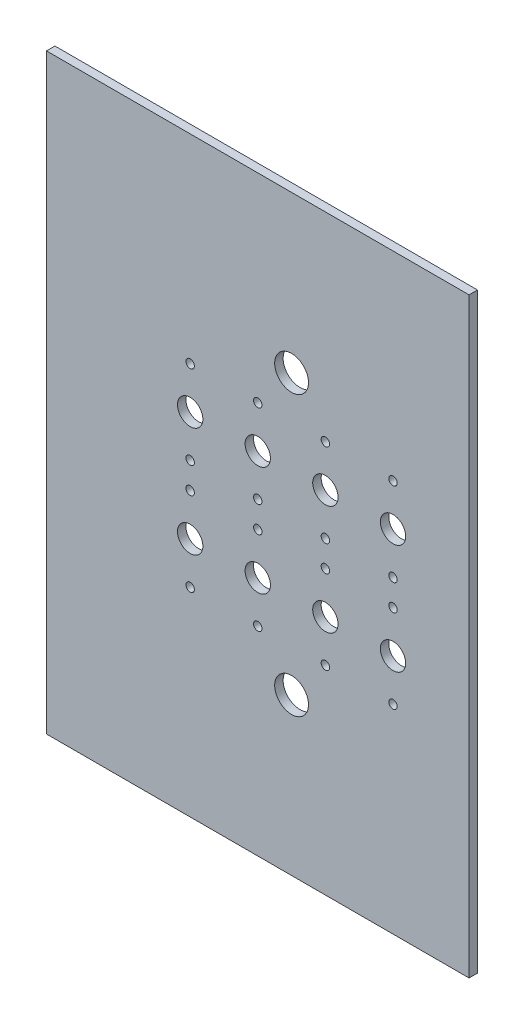
ISO-10303-21;
HEADER;
FILE_DESCRIPTION(('STEP AP214'),'2;1');
FILE_NAME('part.step','',(''),(''),'','','');
FILE_SCHEMA(('AUTOMOTIVE_DESIGN { 1 0 10303 214 1 1 1 1 }'));
ENDSEC;
DATA;
#1=APPLICATION_CONTEXT('core data for automotive mechanical design processes');
#2=APPLICATION_PROTOCOL_DEFINITION('international standard','automotive_design',2000,#1);
#3=PRODUCT_CONTEXT('',#1,'mechanical');
#4=PRODUCT('Part','Part','',(#3));
#5=PRODUCT_RELATED_PRODUCT_CATEGORY('part','',(#4));
#6=PRODUCT_DEFINITION_FORMATION('','',#4);
#7=PRODUCT_DEFINITION_CONTEXT('part definition',#1,'design');
#8=PRODUCT_DEFINITION('design','',#6,#7);
#9=PRODUCT_DEFINITION_SHAPE('','',#8);
#10=(LENGTH_UNIT() NAMED_UNIT(*) SI_UNIT(.MILLI.,.METRE.));
#11=(NAMED_UNIT(*) PLANE_ANGLE_UNIT() SI_UNIT($,.RADIAN.));
#12=(NAMED_UNIT(*) SI_UNIT($,.STERADIAN.) SOLID_ANGLE_UNIT());
#13=UNCERTAINTY_MEASURE_WITH_UNIT(LENGTH_MEASURE(1.E-05),#10,'distance_accuracy_value','');
#14=(GEOMETRIC_REPRESENTATION_CONTEXT(3) GLOBAL_UNCERTAINTY_ASSIGNED_CONTEXT((#13)) GLOBAL_UNIT_ASSIGNED_CONTEXT((#10,
#11,#12)) REPRESENTATION_CONTEXT('',''));
#15=CARTESIAN_POINT('',(0.,0.,0.));
#16=DIRECTION('',(0.,0.,1.));
#17=DIRECTION('',(1.,0.,0.));
#18=AXIS2_PLACEMENT_3D('',#15,#16,#17);
#19=CARTESIAN_POINT('',(0.,0.,10.));
#20=DIRECTION('',(0.,0.,-1.00000000000002));
#21=DIRECTION('',(-1.,0.,0.));
#22=AXIS2_PLACEMENT_3D('',#19,#20,#21);
#23=PLANE('',#22);
#24=CARTESIAN_POINT('',(330.,-65.000000000001,9.99999999999795));
#25=DIRECTION('',(0.,0.,1.00000000000002));
#26=DIRECTION('',(1.,0.,0.));
#27=AXIS2_PLACEMENT_3D('',#24,#25,#26);
#28=CIRCLE('',#27,14.9999999999997);
#29=CARTESIAN_POINT('',(345.,-65.000000000001,9.9999999999979));
#30=VERTEX_POINT('',#29);
#31=EDGE_CURVE('E240',#30,#30,#28,.T.);
#32=ORIENTED_EDGE('',*,*,#31,.F.);
#33=EDGE_LOOP('',(#32));
#34=FACE_BOUND('',#33,.T.);
#35=CARTESIAN_POINT('',(170.,-65.000000000001,9.99999999999795));
#36=DIRECTION('',(0.,0.,1.00000000000002));
#37=DIRECTION('',(1.,0.,0.));
#38=AXIS2_PLACEMENT_3D('',#35,#36,#37);
#39=CIRCLE('',#38,15.);
#40=CARTESIAN_POINT('',(185.,-65.000000000001,9.9999999999979));
#41=VERTEX_POINT('',#40);
#42=EDGE_CURVE('E221',#41,#41,#39,.T.);
#43=ORIENTED_EDGE('',*,*,#42,.F.);
#44=EDGE_LOOP('',(#43));
#45=FACE_BOUND('',#44,.T.);
#46=CARTESIAN_POINT('',(410.,-114.500000000002,9.99999999999795));
#47=DIRECTION('',(0.,0.,1.00000000000002));
#48=DIRECTION('',(1.,0.,0.));
#49=AXIS2_PLACEMENT_3D('',#46,#47,#48);
#50=CIRCLE('',#49,4.99999999999901);
#51=CARTESIAN_POINT('',(414.999999999999,-114.500000000002,9.99999999999793));
#52=VERTEX_POINT('',#51);
#53=EDGE_CURVE('E215',#52,#52,#50,.T.);
#54=ORIENTED_EDGE('',*,*,#53,.F.);
#55=EDGE_LOOP('',(#54));
#56=FACE_BOUND('',#55,.T.);
#57=CARTESIAN_POINT('',(330.,-114.500000000002,9.99999999999795));
#58=DIRECTION('',(0.,0.,1.00000000000002));
#59=DIRECTION('',(1.,0.,0.));
#60=AXIS2_PLACEMENT_3D('',#57,#58,#59);
#61=CIRCLE('',#60,4.99999999999901);
#62=CARTESIAN_POINT('',(334.999999999999,-114.500000000002,9.99999999999793));
#63=VERTEX_POINT('',#62);
#64=EDGE_CURVE('E199',#63,#63,#61,.T.);
#65=ORIENTED_EDGE('',*,*,#64,.F.);
#66=EDGE_LOOP('',(#65));
#67=FACE_BOUND('',#66,.T.);
#68=CARTESIAN_POINT('',(250.,-114.500000000002,9.99999999999795));
#69=DIRECTION('',(0.,0.,1.00000000000002));
#70=DIRECTION('',(1.,0.,0.));
#71=AXIS2_PLACEMENT_3D('',#68,#69,#70);
#72=CIRCLE('',#71,4.99999999999989);
#73=CARTESIAN_POINT('',(255.,-114.500000000002,9.99999999999793));
#74=VERTEX_POINT('',#73);
#75=EDGE_CURVE('E187',#74,#74,#72,.T.);
#76=ORIENTED_EDGE('',*,*,#75,.F.);
#77=EDGE_LOOP('',(#76));
#78=FACE_BOUND('',#77,.T.);
#79=CARTESIAN_POINT('',(170.,-114.500000000002,9.99999999999795));
#80=DIRECTION('',(0.,0.,1.00000000000002));
#81=DIRECTION('',(1.,0.,0.));
#82=AXIS2_PLACEMENT_3D('',#79,#80,#81);
#83=CIRCLE('',#82,4.99999999999989);
#84=CARTESIAN_POINT('',(175.,-114.500000000002,9.99999999999793));
#85=VERTEX_POINT('',#84);
#86=EDGE_CURVE('E176',#85,#85,#83,.T.);
#87=ORIENTED_EDGE('',*,*,#86,.F.);
#88=EDGE_LOOP('',(#87));
#89=FACE_BOUND('',#88,.T.);
#90=CARTESIAN_POINT('',(330.,65.0000000000014,9.99999999999795));
#91=DIRECTION('',(0.,0.,1.00000000000002));
#92=DIRECTION('',(1.,0.,0.));
#93=AXIS2_PLACEMENT_3D('',#90,#91,#92);
#94=CIRCLE('',#93,14.9999999999997);
#95=CARTESIAN_POINT('',(345.,65.0000000000014,9.9999999999979));
#96=VERTEX_POINT('',#95);
#97=EDGE_CURVE('E163',#96,#96,#94,.T.);
#98=ORIENTED_EDGE('',*,*,#97,.F.);
#99=EDGE_LOOP('',(#98));
#100=FACE_BOUND('',#99,.T.);
#101=CARTESIAN_POINT('',(170.,65.0000000000014,9.99999999999795));
#102=DIRECTION('',(0.,0.,1.00000000000002));
#103=DIRECTION('',(1.,0.,0.));
#104=AXIS2_PLACEMENT_3D('',#101,#102,#103);
#105=CIRCLE('',#104,15.);
#106=CARTESIAN_POINT('',(185.,65.0000000000014,9.9999999999979));
#107=VERTEX_POINT('',#106);
#108=EDGE_CURVE('E155',#107,#107,#105,.T.);
#109=ORIENTED_EDGE('',*,*,#108,.F.);
#110=EDGE_LOOP('',(#109));
#111=FACE_BOUND('',#110,.T.);
#112=CARTESIAN_POINT('',(290.,165.,9.99999999999795));
#113=DIRECTION('',(0.,0.,1.00000000000002));
#114=DIRECTION('',(1.,0.,0.));
#115=AXIS2_PLACEMENT_3D('',#112,#113,#114);
#116=CIRCLE('',#115,20.);
#117=CARTESIAN_POINT('',(310.,165.,9.99999999999789));
#118=VERTEX_POINT('',#117);
#119=EDGE_CURVE('E139',#118,#118,#116,.T.);
#120=ORIENTED_EDGE('',*,*,#119,.F.);
#121=EDGE_LOOP('',(#120));
#122=FACE_BOUND('',#121,.T.);
#123=CARTESIAN_POINT('',(410.,114.500000000003,9.99999999999795));
#124=DIRECTION('',(0.,0.,1.00000000000002));
#125=DIRECTION('',(1.,0.,0.));
#126=AXIS2_PLACEMENT_3D('',#123,#124,#125);
#127=CIRCLE('',#126,4.99999999999901);
#128=CARTESIAN_POINT('',(414.999999999999,114.500000000003,9.99999999999793));
#129=VERTEX_POINT('',#128);
#130=EDGE_CURVE('E128',#129,#129,#127,.T.);
#131=ORIENTED_EDGE('',*,*,#130,.F.);
#132=EDGE_LOOP('',(#131));
#133=FACE_BOUND('',#132,.T.);
#134=CARTESIAN_POINT('',(330.,114.500000000003,9.99999999999795));
#135=DIRECTION('',(0.,0.,1.00000000000002));
#136=DIRECTION('',(1.,0.,0.));
#137=AXIS2_PLACEMENT_3D('',#134,#135,#136);
#138=CIRCLE('',#137,4.99999999999901);
#139=CARTESIAN_POINT('',(334.999999999999,114.500000000003,9.99999999999793));
#140=VERTEX_POINT('',#139);
#141=EDGE_CURVE('E116',#140,#140,#138,.T.);
#142=ORIENTED_EDGE('',*,*,#141,.F.);
#143=EDGE_LOOP('',(#142));
#144=FACE_BOUND('',#143,.T.);
#145=CARTESIAN_POINT('',(250.,114.500000000003,9.99999999999795));
#146=DIRECTION('',(0.,0.,1.00000000000002));
#147=DIRECTION('',(1.,0.,0.));
#148=AXIS2_PLACEMENT_3D('',#145,#146,#147);
#149=CIRCLE('',#148,4.99999999999989);
#150=CARTESIAN_POINT('',(255.,114.500000000003,9.99999999999793));
#151=VERTEX_POINT('',#150);
#152=EDGE_CURVE('E102',#151,#151,#149,.T.);
#153=ORIENTED_EDGE('',*,*,#152,.F.);
#154=EDGE_LOOP('',(#153));
#155=FACE_BOUND('',#154,.T.);
#156=CARTESIAN_POINT('',(170.,114.500000000003,9.99999999999795));
#157=DIRECTION('',(0.,0.,1.00000000000002));
#158=DIRECTION('',(1.,0.,0.));
#159=AXIS2_PLACEMENT_3D('',#156,#157,#158);
#160=CIRCLE('',#159,4.99999999999989);
#161=CARTESIAN_POINT('',(175.,114.500000000003,9.99999999999793));
#162=VERTEX_POINT('',#161);
#163=EDGE_CURVE('E83',#162,#162,#160,.T.);
#164=ORIENTED_EDGE('',*,*,#163,.F.);
#165=EDGE_LOOP('',(#164));
#166=FACE_BOUND('',#165,.T.);
#167=DIRECTION('',(0.,-1.00000000000002,0.));
#168=VECTOR('',#167,1.);
#169=CARTESIAN_POINT('',(0.,-350.,10.));
#170=LINE('',#169,#168);
#171=CARTESIAN_POINT('',(0.,350.000000000004,10.));
#172=VERTEX_POINT('',#171);
#173=CARTESIAN_POINT('',(0.,-350.,10.));
#174=VERTEX_POINT('',#173);
#175=EDGE_CURVE('E68',#172,#174,#170,.T.);
#176=ORIENTED_EDGE('',*,*,#175,.T.);
#177=DIRECTION('',(1.,0.,0.));
#178=VECTOR('',#177,1.);
#179=CARTESIAN_POINT('',(500.,-350.,9.9999999999979));
#180=LINE('',#179,#178);
#181=CARTESIAN_POINT('',(500.,-350.,9.9999999999979));
#182=VERTEX_POINT('',#181);
#183=EDGE_CURVE('E64',#174,#182,#180,.T.);
#184=ORIENTED_EDGE('',*,*,#183,.T.);
#185=DIRECTION('',(0.,1.00000000000002,0.));
#186=VECTOR('',#185,1.);
#187=CARTESIAN_POINT('',(500.,350.000000000004,9.9999999999979));
#188=LINE('',#187,#186);
#189=CARTESIAN_POINT('',(500.,350.000000000004,9.9999999999979));
#190=VERTEX_POINT('',#189);
#191=EDGE_CURVE('E66',#182,#190,#188,.T.);
#192=ORIENTED_EDGE('',*,*,#191,.T.);
#193=DIRECTION('',(-1.,0.,0.));
#194=VECTOR('',#193,1.);
#195=CARTESIAN_POINT('',(0.,350.000000000004,10.));
#196=LINE('',#195,#194);
#197=EDGE_CURVE('E31',#190,#172,#196,.T.);
#198=ORIENTED_EDGE('',*,*,#197,.T.);
#199=EDGE_LOOP('',(#176,#184,#192,#198));
#200=FACE_BOUND('',#199,.T.);
#201=CARTESIAN_POINT('',(170.,15.5,9.99999999999795));
#202=DIRECTION('',(0.,0.,1.00000000000002));
#203=DIRECTION('',(1.,0.,0.));
#204=AXIS2_PLACEMENT_3D('',#201,#202,#203);
#205=CIRCLE('',#204,4.99999999999989);
#206=CARTESIAN_POINT('',(175.,15.5,9.99999999999793));
#207=VERTEX_POINT('',#206);
#208=EDGE_CURVE('E98',#207,#207,#205,.T.);
#209=ORIENTED_EDGE('',*,*,#208,.F.);
#210=EDGE_LOOP('',(#209));
#211=FACE_BOUND('',#210,.T.);
#212=CARTESIAN_POINT('',(250.,15.5,9.99999999999795));
#213=DIRECTION('',(0.,0.,1.00000000000002));
#214=DIRECTION('',(1.,0.,0.));
#215=AXIS2_PLACEMENT_3D('',#212,#213,#214);
#216=CIRCLE('',#215,4.99999999999989);
#217=CARTESIAN_POINT('',(255.,15.5,9.99999999999793));
#218=VERTEX_POINT('',#217);
#219=EDGE_CURVE('E109',#218,#218,#216,.T.);
#220=ORIENTED_EDGE('',*,*,#219,.F.);
#221=EDGE_LOOP('',(#220));
#222=FACE_BOUND('',#221,.T.);
#223=CARTESIAN_POINT('',(330.,15.5,9.99999999999795));
#224=DIRECTION('',(0.,0.,1.00000000000002));
#225=DIRECTION('',(1.,0.,0.));
#226=AXIS2_PLACEMENT_3D('',#223,#224,#225);
#227=CIRCLE('',#226,4.99999999999901);
#228=CARTESIAN_POINT('',(334.999999999999,15.5,9.99999999999793));
#229=VERTEX_POINT('',#228);
#230=EDGE_CURVE('E125',#229,#229,#227,.T.);
#231=ORIENTED_EDGE('',*,*,#230,.F.);
#232=EDGE_LOOP('',(#231));
#233=FACE_BOUND('',#232,.T.);
#234=CARTESIAN_POINT('',(410.,15.5,9.99999999999795));
#235=DIRECTION('',(0.,0.,1.00000000000002));
#236=DIRECTION('',(1.,0.,0.));
#237=AXIS2_PLACEMENT_3D('',#234,#235,#236);
#238=CIRCLE('',#237,4.99999999999901);
#239=CARTESIAN_POINT('',(414.999999999999,15.5,9.99999999999793));
#240=VERTEX_POINT('',#239);
#241=EDGE_CURVE('E133',#240,#240,#238,.T.);
#242=ORIENTED_EDGE('',*,*,#241,.F.);
#243=EDGE_LOOP('',(#242));
#244=FACE_BOUND('',#243,.T.);
#245=CARTESIAN_POINT('',(290.,-165.,9.99999999999795));
#246=DIRECTION('',(0.,0.,1.00000000000002));
#247=DIRECTION('',(1.,0.,0.));
#248=AXIS2_PLACEMENT_3D('',#245,#246,#247);
#249=CIRCLE('',#248,20.);
#250=CARTESIAN_POINT('',(310.,-165.,9.99999999999789));
#251=VERTEX_POINT('',#250);
#252=EDGE_CURVE('E148',#251,#251,#249,.T.);
#253=ORIENTED_EDGE('',*,*,#252,.F.);
#254=EDGE_LOOP('',(#253));
#255=FACE_BOUND('',#254,.T.);
#256=CARTESIAN_POINT('',(250.,65.0000000000014,9.99999999999795));
#257=DIRECTION('',(0.,0.,1.00000000000002));
#258=DIRECTION('',(1.,0.,0.));
#259=AXIS2_PLACEMENT_3D('',#256,#257,#258);
#260=CIRCLE('',#259,15.);
#261=CARTESIAN_POINT('',(265.,65.0000000000014,9.9999999999979));
#262=VERTEX_POINT('',#261);
#263=EDGE_CURVE('E158',#262,#262,#260,.T.);
#264=ORIENTED_EDGE('',*,*,#263,.F.);
#265=EDGE_LOOP('',(#264));
#266=FACE_BOUND('',#265,.T.);
#267=CARTESIAN_POINT('',(410.,65.0000000000014,9.99999999999795));
#268=DIRECTION('',(0.,0.,1.00000000000002));
#269=DIRECTION('',(1.,0.,0.));
#270=AXIS2_PLACEMENT_3D('',#267,#268,#269);
#271=CIRCLE('',#270,14.9999999999997);
#272=CARTESIAN_POINT('',(425.,65.0000000000014,9.9999999999979));
#273=VERTEX_POINT('',#272);
#274=EDGE_CURVE('E168',#273,#273,#271,.T.);
#275=ORIENTED_EDGE('',*,*,#274,.F.);
#276=EDGE_LOOP('',(#275));
#277=FACE_BOUND('',#276,.T.);
#278=CARTESIAN_POINT('',(170.,-15.5,9.99999999999795));
#279=DIRECTION('',(0.,0.,1.00000000000002));
#280=DIRECTION('',(1.,0.,0.));
#281=AXIS2_PLACEMENT_3D('',#278,#279,#280);
#282=CIRCLE('',#281,4.99999999999989);
#283=CARTESIAN_POINT('',(175.,-15.5,9.99999999999793));
#284=VERTEX_POINT('',#283);
#285=EDGE_CURVE('E181',#284,#284,#282,.T.);
#286=ORIENTED_EDGE('',*,*,#285,.F.);
#287=EDGE_LOOP('',(#286));
#288=FACE_BOUND('',#287,.T.);
#289=CARTESIAN_POINT('',(250.,-15.5,9.99999999999795));
#290=DIRECTION('',(0.,0.,1.00000000000002));
#291=DIRECTION('',(1.,0.,0.));
#292=AXIS2_PLACEMENT_3D('',#289,#290,#291);
#293=CIRCLE('',#292,4.99999999999989);
#294=CARTESIAN_POINT('',(255.,-15.5,9.99999999999793));
#295=VERTEX_POINT('',#294);
#296=EDGE_CURVE('E192',#295,#295,#293,.T.);
#297=ORIENTED_EDGE('',*,*,#296,.F.);
#298=EDGE_LOOP('',(#297));
#299=FACE_BOUND('',#298,.T.);
#300=CARTESIAN_POINT('',(330.,-15.5,9.99999999999795));
#301=DIRECTION('',(0.,0.,1.00000000000002));
#302=DIRECTION('',(1.,0.,0.));
#303=AXIS2_PLACEMENT_3D('',#300,#301,#302);
#304=CIRCLE('',#303,4.99999999999901);
#305=CARTESIAN_POINT('',(334.999999999999,-15.5,9.99999999999793));
#306=VERTEX_POINT('',#305);
#307=EDGE_CURVE('E206',#306,#306,#304,.T.);
#308=ORIENTED_EDGE('',*,*,#307,.F.);
#309=EDGE_LOOP('',(#308));
#310=FACE_BOUND('',#309,.T.);
#311=CARTESIAN_POINT('',(410.,-15.5,9.99999999999795));
#312=DIRECTION('',(0.,0.,1.00000000000002));
#313=DIRECTION('',(1.,0.,0.));
#314=AXIS2_PLACEMENT_3D('',#311,#312,#313);
#315=CIRCLE('',#314,4.99999999999901);
#316=CARTESIAN_POINT('',(414.999999999999,-15.5,9.99999999999793));
#317=VERTEX_POINT('',#316);
#318=EDGE_CURVE('E217',#317,#317,#315,.T.);
#319=ORIENTED_EDGE('',*,*,#318,.F.);
#320=EDGE_LOOP('',(#319));
#321=FACE_BOUND('',#320,.T.);
#322=CARTESIAN_POINT('',(250.,-65.000000000001,9.99999999999795));
#323=DIRECTION('',(0.,0.,1.00000000000002));
#324=DIRECTION('',(1.,0.,0.));
#325=AXIS2_PLACEMENT_3D('',#322,#323,#324);
#326=CIRCLE('',#325,15.);
#327=CARTESIAN_POINT('',(265.,-65.000000000001,9.9999999999979));
#328=VERTEX_POINT('',#327);
#329=EDGE_CURVE('E230',#328,#328,#326,.T.);
#330=ORIENTED_EDGE('',*,*,#329,.F.);
#331=EDGE_LOOP('',(#330));
#332=FACE_BOUND('',#331,.T.);
#333=CARTESIAN_POINT('',(410.,-65.000000000001,9.99999999999795));
#334=DIRECTION('',(0.,0.,1.00000000000002));
#335=DIRECTION('',(1.,0.,0.));
#336=AXIS2_PLACEMENT_3D('',#333,#334,#335);
#337=CIRCLE('',#336,14.9999999999997);
#338=CARTESIAN_POINT('',(425.,-65.000000000001,9.9999999999979));
#339=VERTEX_POINT('',#338);
#340=EDGE_CURVE('E245',#339,#339,#337,.T.);
#341=ORIENTED_EDGE('',*,*,#340,.F.);
#342=EDGE_LOOP('',(#341));
#343=FACE_BOUND('',#342,.T.);
#344=ADVANCED_FACE('F16',(#34,#45,#56,#67,#78,#89,#100,#111,#122,#133,#144,#155,#166,#200,#211,
#222,#233,#244,#255,#266,#277,#288,#299,#310,#321,#332,#343),#23,.F.);
#345=CARTESIAN_POINT('',(0.,0.,0.));
#346=DIRECTION('',(0.,0.,-1.00000000000002));
#347=DIRECTION('',(-1.,0.,0.));
#348=AXIS2_PLACEMENT_3D('',#345,#346,#347);
#349=PLANE('',#348);
#350=CARTESIAN_POINT('',(330.,-65.000000000001,-2.05391259555654E-12));
#351=DIRECTION('',(0.,0.,1.00000000000002));
#352=DIRECTION('',(1.,0.,0.));
#353=AXIS2_PLACEMENT_3D('',#350,#351,#352);
#354=CIRCLE('',#353,14.9999999999997);
#355=CARTESIAN_POINT('',(345.,-65.000000000001,-2.10225690468453E-12));
#356=VERTEX_POINT('',#355);
#357=EDGE_CURVE('E237',#356,#356,#354,.T.);
#358=ORIENTED_EDGE('',*,*,#357,.T.);
#359=EDGE_LOOP('',(#358));
#360=FACE_BOUND('',#359,.T.);
#361=CARTESIAN_POINT('',(170.,-65.000000000001,-2.05391259555654E-12));
#362=DIRECTION('',(0.,0.,1.00000000000002));
#363=DIRECTION('',(1.,0.,0.));
#364=AXIS2_PLACEMENT_3D('',#361,#362,#363);
#365=CIRCLE('',#364,15.);
#366=CARTESIAN_POINT('',(185.,-65.000000000001,-2.10225690468453E-12));
#367=VERTEX_POINT('',#366);
#368=EDGE_CURVE('E227',#367,#367,#365,.T.);
#369=ORIENTED_EDGE('',*,*,#368,.T.);
#370=EDGE_LOOP('',(#369));
#371=FACE_BOUND('',#370,.T.);
#372=CARTESIAN_POINT('',(410.,-114.500000000002,-2.05391259555654E-12));
#373=DIRECTION('',(0.,0.,1.00000000000002));
#374=DIRECTION('',(1.,0.,0.));
#375=AXIS2_PLACEMENT_3D('',#372,#373,#374);
#376=CIRCLE('',#375,4.99999999999901);
#377=CARTESIAN_POINT('',(414.999999999999,-114.500000000002,-2.07002736526587E-12));
#378=VERTEX_POINT('',#377);
#379=EDGE_CURVE('E214',#378,#378,#376,.T.);
#380=ORIENTED_EDGE('',*,*,#379,.T.);
#381=EDGE_LOOP('',(#380));
#382=FACE_BOUND('',#381,.T.);
#383=CARTESIAN_POINT('',(330.,-114.500000000002,-2.05391259555654E-12));
#384=DIRECTION('',(0.,0.,1.00000000000002));
#385=DIRECTION('',(1.,0.,0.));
#386=AXIS2_PLACEMENT_3D('',#383,#384,#385);
#387=CIRCLE('',#386,4.99999999999901);
#388=CARTESIAN_POINT('',(334.999999999999,-114.500000000002,-2.07002736526587E-12));
#389=VERTEX_POINT('',#388);
#390=EDGE_CURVE('E201',#389,#389,#387,.T.);
#391=ORIENTED_EDGE('',*,*,#390,.T.);
#392=EDGE_LOOP('',(#391));
#393=FACE_BOUND('',#392,.T.);
#394=CARTESIAN_POINT('',(250.,-114.500000000002,-2.05391259555654E-12));
#395=DIRECTION('',(0.,0.,1.00000000000002));
#396=DIRECTION('',(1.,0.,0.));
#397=AXIS2_PLACEMENT_3D('',#394,#395,#396);
#398=CIRCLE('',#397,4.99999999999989);
#399=CARTESIAN_POINT('',(255.,-114.500000000002,-2.07002736526587E-12));
#400=VERTEX_POINT('',#399);
#401=EDGE_CURVE('E191',#400,#400,#398,.T.);
#402=ORIENTED_EDGE('',*,*,#401,.T.);
#403=EDGE_LOOP('',(#402));
#404=FACE_BOUND('',#403,.T.);
#405=CARTESIAN_POINT('',(170.,-114.500000000002,-2.05391259555654E-12));
#406=DIRECTION('',(0.,0.,1.00000000000002));
#407=DIRECTION('',(1.,0.,0.));
#408=AXIS2_PLACEMENT_3D('',#405,#406,#407);
#409=CIRCLE('',#408,4.99999999999989);
#410=CARTESIAN_POINT('',(175.,-114.500000000002,-2.07002736526587E-12));
#411=VERTEX_POINT('',#410);
#412=EDGE_CURVE('E177',#411,#411,#409,.T.);
#413=ORIENTED_EDGE('',*,*,#412,.T.);
#414=EDGE_LOOP('',(#413));
#415=FACE_BOUND('',#414,.T.);
#416=CARTESIAN_POINT('',(330.,65.0000000000014,-2.05391259555654E-12));
#417=DIRECTION('',(0.,0.,1.00000000000002));
#418=DIRECTION('',(1.,0.,0.));
#419=AXIS2_PLACEMENT_3D('',#416,#417,#418);
#420=CIRCLE('',#419,14.9999999999997);
#421=CARTESIAN_POINT('',(345.,65.0000000000014,-2.10225690468453E-12));
#422=VERTEX_POINT('',#421);
#423=EDGE_CURVE('E170',#422,#422,#420,.T.);
#424=ORIENTED_EDGE('',*,*,#423,.T.);
#425=EDGE_LOOP('',(#424));
#426=FACE_BOUND('',#425,.T.);
#427=CARTESIAN_POINT('',(170.,65.0000000000014,-2.05391259555654E-12));
#428=DIRECTION('',(0.,0.,1.00000000000002));
#429=DIRECTION('',(1.,0.,0.));
#430=AXIS2_PLACEMENT_3D('',#427,#428,#429);
#431=CIRCLE('',#430,15.);
#432=CARTESIAN_POINT('',(185.,65.0000000000014,-2.10225690468453E-12));
#433=VERTEX_POINT('',#432);
#434=EDGE_CURVE('E154',#433,#433,#431,.T.);
#435=ORIENTED_EDGE('',*,*,#434,.T.);
#436=EDGE_LOOP('',(#435));
#437=FACE_BOUND('',#436,.T.);
#438=CARTESIAN_POINT('',(290.,165.,-2.05391259555654E-12));
#439=DIRECTION('',(0.,0.,1.00000000000002));
#440=DIRECTION('',(1.,0.,0.));
#441=AXIS2_PLACEMENT_3D('',#438,#439,#440);
#442=CIRCLE('',#441,20.);
#443=CARTESIAN_POINT('',(310.,165.,-2.11837167439386E-12));
#444=VERTEX_POINT('',#443);
#445=EDGE_CURVE('E141',#444,#444,#442,.T.);
#446=ORIENTED_EDGE('',*,*,#445,.T.);
#447=EDGE_LOOP('',(#446));
#448=FACE_BOUND('',#447,.T.);
#449=CARTESIAN_POINT('',(410.,114.500000000003,-2.05391259555654E-12));
#450=DIRECTION('',(0.,0.,1.00000000000002));
#451=DIRECTION('',(1.,0.,0.));
#452=AXIS2_PLACEMENT_3D('',#449,#450,#451);
#453=CIRCLE('',#452,4.99999999999901);
#454=CARTESIAN_POINT('',(414.999999999999,114.500000000003,-2.07002736526587E-12));
#455=VERTEX_POINT('',#454);
#456=EDGE_CURVE('E131',#455,#455,#453,.T.);
#457=ORIENTED_EDGE('',*,*,#456,.T.);
#458=EDGE_LOOP('',(#457));
#459=FACE_BOUND('',#458,.T.);
#460=CARTESIAN_POINT('',(330.,114.500000000003,-2.05391259555654E-12));
#461=DIRECTION('',(0.,0.,1.00000000000002));
#462=DIRECTION('',(1.,0.,0.));
#463=AXIS2_PLACEMENT_3D('',#460,#461,#462);
#464=CIRCLE('',#463,4.99999999999901);
#465=CARTESIAN_POINT('',(334.999999999999,114.500000000003,-2.07002736526587E-12));
#466=VERTEX_POINT('',#465);
#467=EDGE_CURVE('E118',#466,#466,#464,.T.);
#468=ORIENTED_EDGE('',*,*,#467,.T.);
#469=EDGE_LOOP('',(#468));
#470=FACE_BOUND('',#469,.T.);
#471=CARTESIAN_POINT('',(250.,114.500000000003,-2.05391259555654E-12));
#472=DIRECTION('',(0.,0.,1.00000000000002));
#473=DIRECTION('',(1.,0.,0.));
#474=AXIS2_PLACEMENT_3D('',#471,#472,#473);
#475=CIRCLE('',#474,4.99999999999989);
#476=CARTESIAN_POINT('',(255.,114.500000000003,-2.07002736526587E-12));
#477=VERTEX_POINT('',#476);
#478=EDGE_CURVE('E110',#477,#477,#475,.T.);
#479=ORIENTED_EDGE('',*,*,#478,.T.);
#480=EDGE_LOOP('',(#479));
#481=FACE_BOUND('',#480,.T.);
#482=CARTESIAN_POINT('',(170.,114.500000000003,-2.05391259555654E-12));
#483=DIRECTION('',(0.,0.,1.00000000000002));
#484=DIRECTION('',(1.,0.,0.));
#485=AXIS2_PLACEMENT_3D('',#482,#483,#484);
#486=CIRCLE('',#485,4.99999999999989);
#487=CARTESIAN_POINT('',(175.,114.500000000003,-2.07002736526587E-12));
#488=VERTEX_POINT('',#487);
#489=EDGE_CURVE('E92',#488,#488,#486,.T.);
#490=ORIENTED_EDGE('',*,*,#489,.T.);
#491=EDGE_LOOP('',(#490));
#492=FACE_BOUND('',#491,.T.);
#493=DIRECTION('',(0.,-1.00000000000002,0.));
#494=VECTOR('',#493,1.);
#495=CARTESIAN_POINT('',(0.,-350.,0.));
#496=LINE('',#495,#494);
#497=CARTESIAN_POINT('',(0.,350.000000000004,0.));
#498=VERTEX_POINT('',#497);
#499=CARTESIAN_POINT('',(0.,-350.,0.));
#500=VERTEX_POINT('',#499);
#501=EDGE_CURVE('E79',#498,#500,#496,.T.);
#502=ORIENTED_EDGE('',*,*,#501,.F.);
#503=DIRECTION('',(-1.,0.,0.));
#504=VECTOR('',#503,1.);
#505=CARTESIAN_POINT('',(0.,350.000000000004,0.));
#506=LINE('',#505,#504);
#507=CARTESIAN_POINT('',(500.,350.000000000004,-2.05391259555654E-12));
#508=VERTEX_POINT('',#507);
#509=EDGE_CURVE('E57',#508,#498,#506,.T.);
#510=ORIENTED_EDGE('',*,*,#509,.F.);
#511=DIRECTION('',(0.,1.00000000000002,0.));
#512=VECTOR('',#511,1.);
#513=CARTESIAN_POINT('',(500.,350.000000000004,-2.05391259555654E-12));
#514=LINE('',#513,#512);
#515=CARTESIAN_POINT('',(500.,-350.,-2.05391259555654E-12));
#516=VERTEX_POINT('',#515);
#517=EDGE_CURVE('E49',#516,#508,#514,.T.);
#518=ORIENTED_EDGE('',*,*,#517,.F.);
#519=DIRECTION('',(1.,0.,0.));
#520=VECTOR('',#519,1.);
#521=CARTESIAN_POINT('',(500.,-350.,-2.05391259555654E-12));
#522=LINE('',#521,#520);
#523=EDGE_CURVE('E71',#500,#516,#522,.T.);
#524=ORIENTED_EDGE('',*,*,#523,.F.);
#525=EDGE_LOOP('',(#502,#510,#518,#524));
#526=FACE_BOUND('',#525,.T.);
#527=CARTESIAN_POINT('',(170.,15.5,-2.05391259555654E-12));
#528=DIRECTION('',(0.,0.,1.00000000000002));
#529=DIRECTION('',(1.,0.,0.));
#530=AXIS2_PLACEMENT_3D('',#527,#528,#529);
#531=CIRCLE('',#530,4.99999999999989);
#532=CARTESIAN_POINT('',(175.,15.5,-2.07002736526587E-12));
#533=VERTEX_POINT('',#532);
#534=EDGE_CURVE('E101',#533,#533,#531,.T.);
#535=ORIENTED_EDGE('',*,*,#534,.T.);
#536=EDGE_LOOP('',(#535));
#537=FACE_BOUND('',#536,.T.);
#538=CARTESIAN_POINT('',(250.,15.5,-2.05391259555654E-12));
#539=DIRECTION('',(0.,0.,1.00000000000002));
#540=DIRECTION('',(1.,0.,0.));
#541=AXIS2_PLACEMENT_3D('',#538,#539,#540);
#542=CIRCLE('',#541,4.99999999999989);
#543=CARTESIAN_POINT('',(255.,15.5,-2.07002736526587E-12));
#544=VERTEX_POINT('',#543);
#545=EDGE_CURVE('E114',#544,#544,#542,.T.);
#546=ORIENTED_EDGE('',*,*,#545,.T.);
#547=EDGE_LOOP('',(#546));
#548=FACE_BOUND('',#547,.T.);
#549=CARTESIAN_POINT('',(330.,15.5,-2.05391259555654E-12));
#550=DIRECTION('',(0.,0.,1.00000000000002));
#551=DIRECTION('',(1.,0.,0.));
#552=AXIS2_PLACEMENT_3D('',#549,#550,#551);
#553=CIRCLE('',#552,4.99999999999901);
#554=CARTESIAN_POINT('',(334.999999999999,15.5,-2.07002736526587E-12));
#555=VERTEX_POINT('',#554);
#556=EDGE_CURVE('E124',#555,#555,#553,.T.);
#557=ORIENTED_EDGE('',*,*,#556,.T.);
#558=EDGE_LOOP('',(#557));
#559=FACE_BOUND('',#558,.T.);
#560=CARTESIAN_POINT('',(410.,15.5,-2.05391259555654E-12));
#561=DIRECTION('',(0.,0.,1.00000000000002));
#562=DIRECTION('',(1.,0.,0.));
#563=AXIS2_PLACEMENT_3D('',#560,#561,#562);
#564=CIRCLE('',#563,4.99999999999901);
#565=CARTESIAN_POINT('',(414.999999999999,15.5,-2.07002736526587E-12));
#566=VERTEX_POINT('',#565);
#567=EDGE_CURVE('E140',#566,#566,#564,.T.);
#568=ORIENTED_EDGE('',*,*,#567,.T.);
#569=EDGE_LOOP('',(#568));
#570=FACE_BOUND('',#569,.T.);
#571=CARTESIAN_POINT('',(290.,-165.,-2.05391259555654E-12));
#572=DIRECTION('',(0.,0.,1.00000000000002));
#573=DIRECTION('',(1.,0.,0.));
#574=AXIS2_PLACEMENT_3D('',#571,#572,#573);
#575=CIRCLE('',#574,20.);
#576=CARTESIAN_POINT('',(310.,-165.,-2.11837167439386E-12));
#577=VERTEX_POINT('',#576);
#578=EDGE_CURVE('E149',#577,#577,#575,.T.);
#579=ORIENTED_EDGE('',*,*,#578,.T.);
#580=EDGE_LOOP('',(#579));
#581=FACE_BOUND('',#580,.T.);
#582=CARTESIAN_POINT('',(250.,65.0000000000014,-2.05391259555654E-12));
#583=DIRECTION('',(0.,0.,1.00000000000002));
#584=DIRECTION('',(1.,0.,0.));
#585=AXIS2_PLACEMENT_3D('',#582,#583,#584);
#586=CIRCLE('',#585,15.);
#587=CARTESIAN_POINT('',(265.,65.0000000000014,-2.10225690468453E-12));
#588=VERTEX_POINT('',#587);
#589=EDGE_CURVE('E161',#588,#588,#586,.T.);
#590=ORIENTED_EDGE('',*,*,#589,.T.);
#591=EDGE_LOOP('',(#590));
#592=FACE_BOUND('',#591,.T.);
#593=CARTESIAN_POINT('',(410.,65.0000000000014,-2.05391259555654E-12));
#594=DIRECTION('',(0.,0.,1.00000000000002));
#595=DIRECTION('',(1.,0.,0.));
#596=AXIS2_PLACEMENT_3D('',#593,#594,#595);
#597=CIRCLE('',#596,14.9999999999997);
#598=CARTESIAN_POINT('',(425.,65.0000000000014,-2.10225690468453E-12));
#599=VERTEX_POINT('',#598);
#600=EDGE_CURVE('E174',#599,#599,#597,.T.);
#601=ORIENTED_EDGE('',*,*,#600,.T.);
#602=EDGE_LOOP('',(#601));
#603=FACE_BOUND('',#602,.T.);
#604=CARTESIAN_POINT('',(170.,-15.5,-2.05391259555654E-12));
#605=DIRECTION('',(0.,0.,1.00000000000002));
#606=DIRECTION('',(1.,0.,0.));
#607=AXIS2_PLACEMENT_3D('',#604,#605,#606);
#608=CIRCLE('',#607,4.99999999999989);
#609=CARTESIAN_POINT('',(175.,-15.5,-2.07002736526587E-12));
#610=VERTEX_POINT('',#609);
#611=EDGE_CURVE('E184',#610,#610,#608,.T.);
#612=ORIENTED_EDGE('',*,*,#611,.T.);
#613=EDGE_LOOP('',(#612));
#614=FACE_BOUND('',#613,.T.);
#615=CARTESIAN_POINT('',(250.,-15.5,-2.05391259555654E-12));
#616=DIRECTION('',(0.,0.,1.00000000000002));
#617=DIRECTION('',(1.,0.,0.));
#618=AXIS2_PLACEMENT_3D('',#615,#616,#617);
#619=CIRCLE('',#618,4.99999999999989);
#620=CARTESIAN_POINT('',(255.,-15.5,-2.07002736526587E-12));
#621=VERTEX_POINT('',#620);
#622=EDGE_CURVE('E197',#621,#621,#619,.T.);
#623=ORIENTED_EDGE('',*,*,#622,.T.);
#624=EDGE_LOOP('',(#623));
#625=FACE_BOUND('',#624,.T.);
#626=CARTESIAN_POINT('',(330.,-15.5,-2.05391259555654E-12));
#627=DIRECTION('',(0.,0.,1.00000000000002));
#628=DIRECTION('',(1.,0.,0.));
#629=AXIS2_PLACEMENT_3D('',#626,#627,#628);
#630=CIRCLE('',#629,4.99999999999901);
#631=CARTESIAN_POINT('',(334.999999999999,-15.5,-2.07002736526587E-12));
#632=VERTEX_POINT('',#631);
#633=EDGE_CURVE('E207',#632,#632,#630,.T.);
#634=ORIENTED_EDGE('',*,*,#633,.T.);
#635=EDGE_LOOP('',(#634));
#636=FACE_BOUND('',#635,.T.);
#637=CARTESIAN_POINT('',(410.,-15.5,-2.05391259555654E-12));
#638=DIRECTION('',(0.,0.,1.00000000000002));
#639=DIRECTION('',(1.,0.,0.));
#640=AXIS2_PLACEMENT_3D('',#637,#638,#639);
#641=CIRCLE('',#640,4.99999999999901);
#642=CARTESIAN_POINT('',(414.999999999999,-15.5,-2.07002736526587E-12));
#643=VERTEX_POINT('',#642);
#644=EDGE_CURVE('E222',#643,#643,#641,.T.);
#645=ORIENTED_EDGE('',*,*,#644,.T.);
#646=EDGE_LOOP('',(#645));
#647=FACE_BOUND('',#646,.T.);
#648=CARTESIAN_POINT('',(250.,-65.000000000001,-2.05391259555654E-12));
#649=DIRECTION('',(0.,0.,1.00000000000002));
#650=DIRECTION('',(1.,0.,0.));
#651=AXIS2_PLACEMENT_3D('',#648,#649,#650);
#652=CIRCLE('',#651,15.);
#653=CARTESIAN_POINT('',(265.,-65.000000000001,-2.10225690468453E-12));
#654=VERTEX_POINT('',#653);
#655=EDGE_CURVE('E233',#654,#654,#652,.T.);
#656=ORIENTED_EDGE('',*,*,#655,.T.);
#657=EDGE_LOOP('',(#656));
#658=FACE_BOUND('',#657,.T.);
#659=CARTESIAN_POINT('',(410.,-65.000000000001,-2.05391259555654E-12));
#660=DIRECTION('',(0.,0.,1.00000000000002));
#661=DIRECTION('',(1.,0.,0.));
#662=AXIS2_PLACEMENT_3D('',#659,#660,#661);
#663=CIRCLE('',#662,14.9999999999997);
#664=CARTESIAN_POINT('',(425.,-65.000000000001,-2.10225690468453E-12));
#665=VERTEX_POINT('',#664);
#666=EDGE_CURVE('E244',#665,#665,#663,.T.);
#667=ORIENTED_EDGE('',*,*,#666,.T.);
#668=EDGE_LOOP('',(#667));
#669=FACE_BOUND('',#668,.T.);
#670=ADVANCED_FACE('F93',(#360,#371,#382,#393,#404,#415,#426,#437,#448,#459,#470,#481,#492,#526,
#537,#548,#559,#570,#581,#592,#603,#614,#625,#636,#647,#658,#669),#349,.T.);
#671=CARTESIAN_POINT('',(0.,-350.,10.));
#672=DIRECTION('',(1.,0.,0.));
#673=DIRECTION('',(0.,0.,-1.00000000000002));
#674=AXIS2_PLACEMENT_3D('',#671,#672,#673);
#675=PLANE('',#674);
#676=ORIENTED_EDGE('',*,*,#501,.T.);
#677=DIRECTION('',(0.,0.,-1.00000000000002));
#678=VECTOR('',#677,1.);
#679=CARTESIAN_POINT('',(0.,-350.,10.));
#680=LINE('',#679,#678);
#681=EDGE_CURVE('E11',#174,#500,#680,.T.);
#682=ORIENTED_EDGE('',*,*,#681,.F.);
#683=ORIENTED_EDGE('',*,*,#175,.F.);
#684=DIRECTION('',(0.,0.,-1.00000000000002));
#685=VECTOR('',#684,1.);
#686=CARTESIAN_POINT('',(0.,350.000000000004,10.));
#687=LINE('',#686,#685);
#688=EDGE_CURVE('E76',#172,#498,#687,.T.);
#689=ORIENTED_EDGE('',*,*,#688,.T.);
#690=EDGE_LOOP('',(#676,#682,#683,#689));
#691=FACE_BOUND('',#690,.T.);
#692=ADVANCED_FACE('F18',(#691),#675,.F.);
#693=CARTESIAN_POINT('',(500.,-350.,9.9999999999979));
#694=DIRECTION('',(0.,1.00000000000002,0.));
#695=DIRECTION('',(0.,0.,1.00000000000002));
#696=AXIS2_PLACEMENT_3D('',#693,#694,#695);
#697=PLANE('',#696);
#698=ORIENTED_EDGE('',*,*,#523,.T.);
#699=DIRECTION('',(0.,0.,-1.00000000000002));
#700=VECTOR('',#699,1.);
#701=CARTESIAN_POINT('',(500.,-350.,9.9999999999979));
#702=LINE('',#701,#700);
#703=EDGE_CURVE('E25',#182,#516,#702,.T.);
#704=ORIENTED_EDGE('',*,*,#703,.F.);
#705=ORIENTED_EDGE('',*,*,#183,.F.);
#706=ORIENTED_EDGE('',*,*,#681,.T.);
#707=EDGE_LOOP('',(#698,#704,#705,#706));
#708=FACE_BOUND('',#707,.T.);
#709=ADVANCED_FACE('F75',(#708),#697,.F.);
#710=CARTESIAN_POINT('',(500.,350.000000000004,9.9999999999979));
#711=DIRECTION('',(-1.,0.,0.));
#712=DIRECTION('',(0.,0.,1.00000000000002));
#713=AXIS2_PLACEMENT_3D('',#710,#711,#712);
#714=PLANE('',#713);
#715=ORIENTED_EDGE('',*,*,#517,.T.);
#716=DIRECTION('',(0.,0.,-1.00000000000002));
#717=VECTOR('',#716,1.);
#718=CARTESIAN_POINT('',(500.,350.000000000004,9.9999999999979));
#719=LINE('',#718,#717);
#720=EDGE_CURVE('E73',#190,#508,#719,.T.);
#721=ORIENTED_EDGE('',*,*,#720,.F.);
#722=ORIENTED_EDGE('',*,*,#191,.F.);
#723=ORIENTED_EDGE('',*,*,#703,.T.);
#724=EDGE_LOOP('',(#715,#721,#722,#723));
#725=FACE_BOUND('',#724,.T.);
#726=ADVANCED_FACE('F72',(#725),#714,.F.);
#727=CARTESIAN_POINT('',(0.,350.000000000004,10.));
#728=DIRECTION('',(0.,-1.00000000000002,0.));
#729=DIRECTION('',(0.,0.,-1.00000000000002));
#730=AXIS2_PLACEMENT_3D('',#727,#728,#729);
#731=PLANE('',#730);
#732=ORIENTED_EDGE('',*,*,#509,.T.);
#733=ORIENTED_EDGE('',*,*,#688,.F.);
#734=ORIENTED_EDGE('',*,*,#197,.F.);
#735=ORIENTED_EDGE('',*,*,#720,.T.);
#736=EDGE_LOOP('',(#732,#733,#734,#735));
#737=FACE_BOUND('',#736,.T.);
#738=ADVANCED_FACE('F86',(#737),#731,.F.);
#739=CARTESIAN_POINT('',(170.,114.500000000003,9.99999999999795));
#740=DIRECTION('',(0.,0.,-1.00000000000002));
#741=DIRECTION('',(-1.,0.,0.));
#742=AXIS2_PLACEMENT_3D('',#739,#740,#741);
#743=CYLINDRICAL_SURFACE('',#742,4.99999999999989);
#744=ORIENTED_EDGE('',*,*,#163,.T.);
#745=EDGE_LOOP('',(#744));
#746=FACE_BOUND('',#745,.T.);
#747=ORIENTED_EDGE('',*,*,#489,.F.);
#748=EDGE_LOOP('',(#747));
#749=FACE_BOUND('',#748,.T.);
#750=ADVANCED_FACE('F270',(#746,#749),#743,.F.);
#751=CARTESIAN_POINT('',(170.,15.5,9.99999999999795));
#752=DIRECTION('',(0.,0.,-1.00000000000002));
#753=DIRECTION('',(-1.,0.,0.));
#754=AXIS2_PLACEMENT_3D('',#751,#752,#753);
#755=CYLINDRICAL_SURFACE('',#754,4.99999999999989);
#756=ORIENTED_EDGE('',*,*,#208,.T.);
#757=EDGE_LOOP('',(#756));
#758=FACE_BOUND('',#757,.T.);
#759=ORIENTED_EDGE('',*,*,#534,.F.);
#760=EDGE_LOOP('',(#759));
#761=FACE_BOUND('',#760,.T.);
#762=ADVANCED_FACE('F308',(#758,#761),#755,.F.);
#763=CARTESIAN_POINT('',(250.,114.500000000003,9.99999999999795));
#764=DIRECTION('',(0.,0.,-1.00000000000002));
#765=DIRECTION('',(-1.,0.,0.));
#766=AXIS2_PLACEMENT_3D('',#763,#764,#765);
#767=CYLINDRICAL_SURFACE('',#766,4.99999999999989);
#768=ORIENTED_EDGE('',*,*,#152,.T.);
#769=EDGE_LOOP('',(#768));
#770=FACE_BOUND('',#769,.T.);
#771=ORIENTED_EDGE('',*,*,#478,.F.);
#772=EDGE_LOOP('',(#771));
#773=FACE_BOUND('',#772,.T.);
#774=ADVANCED_FACE('F311',(#770,#773),#767,.F.);
#775=CARTESIAN_POINT('',(250.,15.5,9.99999999999795));
#776=DIRECTION('',(0.,0.,-1.00000000000002));
#777=DIRECTION('',(-1.,0.,0.));
#778=AXIS2_PLACEMENT_3D('',#775,#776,#777);
#779=CYLINDRICAL_SURFACE('',#778,4.99999999999989);
#780=ORIENTED_EDGE('',*,*,#219,.T.);
#781=EDGE_LOOP('',(#780));
#782=FACE_BOUND('',#781,.T.);
#783=ORIENTED_EDGE('',*,*,#545,.F.);
#784=EDGE_LOOP('',(#783));
#785=FACE_BOUND('',#784,.T.);
#786=ADVANCED_FACE('F319',(#782,#785),#779,.F.);
#787=CARTESIAN_POINT('',(330.,114.500000000003,9.99999999999795));
#788=DIRECTION('',(0.,0.,-1.00000000000002));
#789=DIRECTION('',(-1.,0.,0.));
#790=AXIS2_PLACEMENT_3D('',#787,#788,#789);
#791=CYLINDRICAL_SURFACE('',#790,4.99999999999901);
#792=ORIENTED_EDGE('',*,*,#141,.T.);
#793=EDGE_LOOP('',(#792));
#794=FACE_BOUND('',#793,.T.);
#795=ORIENTED_EDGE('',*,*,#467,.F.);
#796=EDGE_LOOP('',(#795));
#797=FACE_BOUND('',#796,.T.);
#798=ADVANCED_FACE('F327',(#794,#797),#791,.F.);
#799=CARTESIAN_POINT('',(330.,15.5,9.99999999999795));
#800=DIRECTION('',(0.,0.,-1.00000000000002));
#801=DIRECTION('',(-1.,0.,0.));
#802=AXIS2_PLACEMENT_3D('',#799,#800,#801);
#803=CYLINDRICAL_SURFACE('',#802,4.99999999999901);
#804=ORIENTED_EDGE('',*,*,#230,.T.);
#805=EDGE_LOOP('',(#804));
#806=FACE_BOUND('',#805,.T.);
#807=ORIENTED_EDGE('',*,*,#556,.F.);
#808=EDGE_LOOP('',(#807));
#809=FACE_BOUND('',#808,.T.);
#810=ADVANCED_FACE('F336',(#806,#809),#803,.F.);
#811=CARTESIAN_POINT('',(410.,114.500000000003,9.99999999999795));
#812=DIRECTION('',(0.,0.,-1.00000000000002));
#813=DIRECTION('',(-1.,0.,0.));
#814=AXIS2_PLACEMENT_3D('',#811,#812,#813);
#815=CYLINDRICAL_SURFACE('',#814,4.99999999999901);
#816=ORIENTED_EDGE('',*,*,#130,.T.);
#817=EDGE_LOOP('',(#816));
#818=FACE_BOUND('',#817,.T.);
#819=ORIENTED_EDGE('',*,*,#456,.F.);
#820=EDGE_LOOP('',(#819));
#821=FACE_BOUND('',#820,.T.);
#822=ADVANCED_FACE('F342',(#818,#821),#815,.F.);
#823=CARTESIAN_POINT('',(410.,15.5,9.99999999999795));
#824=DIRECTION('',(0.,0.,-1.00000000000002));
#825=DIRECTION('',(-1.,0.,0.));
#826=AXIS2_PLACEMENT_3D('',#823,#824,#825);
#827=CYLINDRICAL_SURFACE('',#826,4.99999999999901);
#828=ORIENTED_EDGE('',*,*,#241,.T.);
#829=EDGE_LOOP('',(#828));
#830=FACE_BOUND('',#829,.T.);
#831=ORIENTED_EDGE('',*,*,#567,.F.);
#832=EDGE_LOOP('',(#831));
#833=FACE_BOUND('',#832,.T.);
#834=ADVANCED_FACE('F355',(#830,#833),#827,.F.);
#835=CARTESIAN_POINT('',(290.,165.,9.99999999999795));
#836=DIRECTION('',(0.,0.,-1.00000000000002));
#837=DIRECTION('',(-1.,0.,0.));
#838=AXIS2_PLACEMENT_3D('',#835,#836,#837);
#839=CYLINDRICAL_SURFACE('',#838,20.);
#840=ORIENTED_EDGE('',*,*,#119,.T.);
#841=EDGE_LOOP('',(#840));
#842=FACE_BOUND('',#841,.T.);
#843=ORIENTED_EDGE('',*,*,#445,.F.);
#844=EDGE_LOOP('',(#843));
#845=FACE_BOUND('',#844,.T.);
#846=ADVANCED_FACE('F359',(#842,#845),#839,.F.);
#847=CARTESIAN_POINT('',(290.,-165.,9.99999999999795));
#848=DIRECTION('',(0.,0.,-1.00000000000002));
#849=DIRECTION('',(-1.,0.,0.));
#850=AXIS2_PLACEMENT_3D('',#847,#848,#849);
#851=CYLINDRICAL_SURFACE('',#850,20.);
#852=ORIENTED_EDGE('',*,*,#252,.T.);
#853=EDGE_LOOP('',(#852));
#854=FACE_BOUND('',#853,.T.);
#855=ORIENTED_EDGE('',*,*,#578,.F.);
#856=EDGE_LOOP('',(#855));
#857=FACE_BOUND('',#856,.T.);
#858=ADVANCED_FACE('F366',(#854,#857),#851,.F.);
#859=CARTESIAN_POINT('',(170.,65.0000000000014,9.99999999999795));
#860=DIRECTION('',(0.,0.,-1.00000000000002));
#861=DIRECTION('',(-1.,0.,0.));
#862=AXIS2_PLACEMENT_3D('',#859,#860,#861);
#863=CYLINDRICAL_SURFACE('',#862,15.);
#864=ORIENTED_EDGE('',*,*,#108,.T.);
#865=EDGE_LOOP('',(#864));
#866=FACE_BOUND('',#865,.T.);
#867=ORIENTED_EDGE('',*,*,#434,.F.);
#868=EDGE_LOOP('',(#867));
#869=FACE_BOUND('',#868,.T.);
#870=ADVANCED_FACE('F376',(#866,#869),#863,.F.);
#871=CARTESIAN_POINT('',(250.,65.0000000000014,9.99999999999795));
#872=DIRECTION('',(0.,0.,-1.00000000000002));
#873=DIRECTION('',(-1.,0.,0.));
#874=AXIS2_PLACEMENT_3D('',#871,#872,#873);
#875=CYLINDRICAL_SURFACE('',#874,15.);
#876=ORIENTED_EDGE('',*,*,#263,.T.);
#877=EDGE_LOOP('',(#876));
#878=FACE_BOUND('',#877,.T.);
#879=ORIENTED_EDGE('',*,*,#589,.F.);
#880=EDGE_LOOP('',(#879));
#881=FACE_BOUND('',#880,.T.);
#882=ADVANCED_FACE('F383',(#878,#881),#875,.F.);
#883=CARTESIAN_POINT('',(330.,65.0000000000014,9.99999999999795));
#884=DIRECTION('',(0.,0.,-1.00000000000002));
#885=DIRECTION('',(-1.,0.,0.));
#886=AXIS2_PLACEMENT_3D('',#883,#884,#885);
#887=CYLINDRICAL_SURFACE('',#886,14.9999999999997);
#888=ORIENTED_EDGE('',*,*,#97,.T.);
#889=EDGE_LOOP('',(#888));
#890=FACE_BOUND('',#889,.T.);
#891=ORIENTED_EDGE('',*,*,#423,.F.);
#892=EDGE_LOOP('',(#891));
#893=FACE_BOUND('',#892,.T.);
#894=ADVANCED_FACE('F392',(#890,#893),#887,.F.);
#895=CARTESIAN_POINT('',(410.,65.0000000000014,9.99999999999795));
#896=DIRECTION('',(0.,0.,-1.00000000000002));
#897=DIRECTION('',(-1.,0.,0.));
#898=AXIS2_PLACEMENT_3D('',#895,#896,#897);
#899=CYLINDRICAL_SURFACE('',#898,14.9999999999997);
#900=ORIENTED_EDGE('',*,*,#274,.T.);
#901=EDGE_LOOP('',(#900));
#902=FACE_BOUND('',#901,.T.);
#903=ORIENTED_EDGE('',*,*,#600,.F.);
#904=EDGE_LOOP('',(#903));
#905=FACE_BOUND('',#904,.T.);
#906=ADVANCED_FACE('F399',(#902,#905),#899,.F.);
#907=CARTESIAN_POINT('',(170.,-114.500000000002,9.99999999999795));
#908=DIRECTION('',(0.,0.,-1.00000000000002));
#909=DIRECTION('',(-1.,0.,0.));
#910=AXIS2_PLACEMENT_3D('',#907,#908,#909);
#911=CYLINDRICAL_SURFACE('',#910,4.99999999999989);
#912=ORIENTED_EDGE('',*,*,#86,.T.);
#913=EDGE_LOOP('',(#912));
#914=FACE_BOUND('',#913,.T.);
#915=ORIENTED_EDGE('',*,*,#412,.F.);
#916=EDGE_LOOP('',(#915));
#917=FACE_BOUND('',#916,.T.);
#918=ADVANCED_FACE('F407',(#914,#917),#911,.F.);
#919=CARTESIAN_POINT('',(170.,-15.5,9.99999999999795));
#920=DIRECTION('',(0.,0.,-1.00000000000002));
#921=DIRECTION('',(-1.,0.,0.));
#922=AXIS2_PLACEMENT_3D('',#919,#920,#921);
#923=CYLINDRICAL_SURFACE('',#922,4.99999999999989);
#924=ORIENTED_EDGE('',*,*,#285,.T.);
#925=EDGE_LOOP('',(#924));
#926=FACE_BOUND('',#925,.T.);
#927=ORIENTED_EDGE('',*,*,#611,.F.);
#928=EDGE_LOOP('',(#927));
#929=FACE_BOUND('',#928,.T.);
#930=ADVANCED_FACE('F418',(#926,#929),#923,.F.);
#931=CARTESIAN_POINT('',(250.,-114.500000000002,9.99999999999795));
#932=DIRECTION('',(0.,0.,-1.00000000000002));
#933=DIRECTION('',(-1.,0.,0.));
#934=AXIS2_PLACEMENT_3D('',#931,#932,#933);
#935=CYLINDRICAL_SURFACE('',#934,4.99999999999989);
#936=ORIENTED_EDGE('',*,*,#75,.T.);
#937=EDGE_LOOP('',(#936));
#938=FACE_BOUND('',#937,.T.);
#939=ORIENTED_EDGE('',*,*,#401,.F.);
#940=EDGE_LOOP('',(#939));
#941=FACE_BOUND('',#940,.T.);
#942=ADVANCED_FACE('F424',(#938,#941),#935,.F.);
#943=CARTESIAN_POINT('',(250.,-15.5,9.99999999999795));
#944=DIRECTION('',(0.,0.,-1.00000000000002));
#945=DIRECTION('',(-1.,0.,0.));
#946=AXIS2_PLACEMENT_3D('',#943,#944,#945);
#947=CYLINDRICAL_SURFACE('',#946,4.99999999999989);
#948=ORIENTED_EDGE('',*,*,#296,.T.);
#949=EDGE_LOOP('',(#948));
#950=FACE_BOUND('',#949,.T.);
#951=ORIENTED_EDGE('',*,*,#622,.F.);
#952=EDGE_LOOP('',(#951));
#953=FACE_BOUND('',#952,.T.);
#954=ADVANCED_FACE('F435',(#950,#953),#947,.F.);
#955=CARTESIAN_POINT('',(330.,-114.500000000002,9.99999999999795));
#956=DIRECTION('',(0.,0.,-1.00000000000002));
#957=DIRECTION('',(-1.,0.,0.));
#958=AXIS2_PLACEMENT_3D('',#955,#956,#957);
#959=CYLINDRICAL_SURFACE('',#958,4.99999999999901);
#960=ORIENTED_EDGE('',*,*,#64,.T.);
#961=EDGE_LOOP('',(#960));
#962=FACE_BOUND('',#961,.T.);
#963=ORIENTED_EDGE('',*,*,#390,.F.);
#964=EDGE_LOOP('',(#963));
#965=FACE_BOUND('',#964,.T.);
#966=ADVANCED_FACE('F439',(#962,#965),#959,.F.);
#967=CARTESIAN_POINT('',(330.,-15.5,9.99999999999795));
#968=DIRECTION('',(0.,0.,-1.00000000000002));
#969=DIRECTION('',(-1.,0.,0.));
#970=AXIS2_PLACEMENT_3D('',#967,#968,#969);
#971=CYLINDRICAL_SURFACE('',#970,4.99999999999901);
#972=ORIENTED_EDGE('',*,*,#307,.T.);
#973=EDGE_LOOP('',(#972));
#974=FACE_BOUND('',#973,.T.);
#975=ORIENTED_EDGE('',*,*,#633,.F.);
#976=EDGE_LOOP('',(#975));
#977=FACE_BOUND('',#976,.T.);
#978=ADVANCED_FACE('F449',(#974,#977),#971,.F.);
#979=CARTESIAN_POINT('',(410.,-114.500000000002,9.99999999999795));
#980=DIRECTION('',(0.,0.,-1.00000000000002));
#981=DIRECTION('',(-1.,0.,0.));
#982=AXIS2_PLACEMENT_3D('',#979,#980,#981);
#983=CYLINDRICAL_SURFACE('',#982,4.99999999999901);
#984=ORIENTED_EDGE('',*,*,#53,.T.);
#985=EDGE_LOOP('',(#984));
#986=FACE_BOUND('',#985,.T.);
#987=ORIENTED_EDGE('',*,*,#379,.F.);
#988=EDGE_LOOP('',(#987));
#989=FACE_BOUND('',#988,.T.);
#990=ADVANCED_FACE('F460',(#986,#989),#983,.F.);
#991=CARTESIAN_POINT('',(410.,-15.5,9.99999999999795));
#992=DIRECTION('',(0.,0.,-1.00000000000002));
#993=DIRECTION('',(-1.,0.,0.));
#994=AXIS2_PLACEMENT_3D('',#991,#992,#993);
#995=CYLINDRICAL_SURFACE('',#994,4.99999999999901);
#996=ORIENTED_EDGE('',*,*,#318,.T.);
#997=EDGE_LOOP('',(#996));
#998=FACE_BOUND('',#997,.T.);
#999=ORIENTED_EDGE('',*,*,#644,.F.);
#1000=EDGE_LOOP('',(#999));
#1001=FACE_BOUND('',#1000,.T.);
#1002=ADVANCED_FACE('F463',(#998,#1001),#995,.F.);
#1003=CARTESIAN_POINT('',(170.,-65.000000000001,9.99999999999795));
#1004=DIRECTION('',(0.,0.,-1.00000000000002));
#1005=DIRECTION('',(-1.,0.,0.));
#1006=AXIS2_PLACEMENT_3D('',#1003,#1004,#1005);
#1007=CYLINDRICAL_SURFACE('',#1006,15.);
#1008=ORIENTED_EDGE('',*,*,#42,.T.);
#1009=EDGE_LOOP('',(#1008));
#1010=FACE_BOUND('',#1009,.T.);
#1011=ORIENTED_EDGE('',*,*,#368,.F.);
#1012=EDGE_LOOP('',(#1011));
#1013=FACE_BOUND('',#1012,.T.);
#1014=ADVANCED_FACE('F472',(#1010,#1013),#1007,.F.);
#1015=CARTESIAN_POINT('',(250.,-65.000000000001,9.99999999999795));
#1016=DIRECTION('',(0.,0.,-1.00000000000002));
#1017=DIRECTION('',(-1.,0.,0.));
#1018=AXIS2_PLACEMENT_3D('',#1015,#1016,#1017);
#1019=CYLINDRICAL_SURFACE('',#1018,15.);
#1020=ORIENTED_EDGE('',*,*,#329,.T.);
#1021=EDGE_LOOP('',(#1020));
#1022=FACE_BOUND('',#1021,.T.);
#1023=ORIENTED_EDGE('',*,*,#655,.F.);
#1024=EDGE_LOOP('',(#1023));
#1025=FACE_BOUND('',#1024,.T.);
#1026=ADVANCED_FACE('F477',(#1022,#1025),#1019,.F.);
#1027=CARTESIAN_POINT('',(330.,-65.000000000001,9.99999999999795));
#1028=DIRECTION('',(0.,0.,-1.00000000000002));
#1029=DIRECTION('',(-1.,0.,0.));
#1030=AXIS2_PLACEMENT_3D('',#1027,#1028,#1029);
#1031=CYLINDRICAL_SURFACE('',#1030,14.9999999999997);
#1032=ORIENTED_EDGE('',*,*,#31,.T.);
#1033=EDGE_LOOP('',(#1032));
#1034=FACE_BOUND('',#1033,.T.);
#1035=ORIENTED_EDGE('',*,*,#357,.F.);
#1036=EDGE_LOOP('',(#1035));
#1037=FACE_BOUND('',#1036,.T.);
#1038=ADVANCED_FACE('F488',(#1034,#1037),#1031,.F.);
#1039=CARTESIAN_POINT('',(410.,-65.000000000001,9.99999999999795));
#1040=DIRECTION('',(0.,0.,-1.00000000000002));
#1041=DIRECTION('',(-1.,0.,0.));
#1042=AXIS2_PLACEMENT_3D('',#1039,#1040,#1041);
#1043=CYLINDRICAL_SURFACE('',#1042,14.9999999999997);
#1044=ORIENTED_EDGE('',*,*,#340,.T.);
#1045=EDGE_LOOP('',(#1044));
#1046=FACE_BOUND('',#1045,.T.);
#1047=ORIENTED_EDGE('',*,*,#666,.F.);
#1048=EDGE_LOOP('',(#1047));
#1049=FACE_BOUND('',#1048,.T.);
#1050=ADVANCED_FACE('F253',(#1046,#1049),#1043,.F.);
#1051=CLOSED_SHELL('',(#344,#670,#692,#709,#726,#738,#750,#762,#774,#786,#798,#810,#822,#834,
#846,#858,#870,#882,#894,#906,#918,#930,#942,#954,#966,#978,#990,#1002,#1014,#1026,#1038,#1050));
#1052=MANIFOLD_SOLID_BREP('B1',#1051);
#1053=ADVANCED_BREP_SHAPE_REPRESENTATION('',(#18,#1052),#14);
#1054=SHAPE_DEFINITION_REPRESENTATION(#9,#1053);
ENDSEC;
END-ISO-10303-21;
